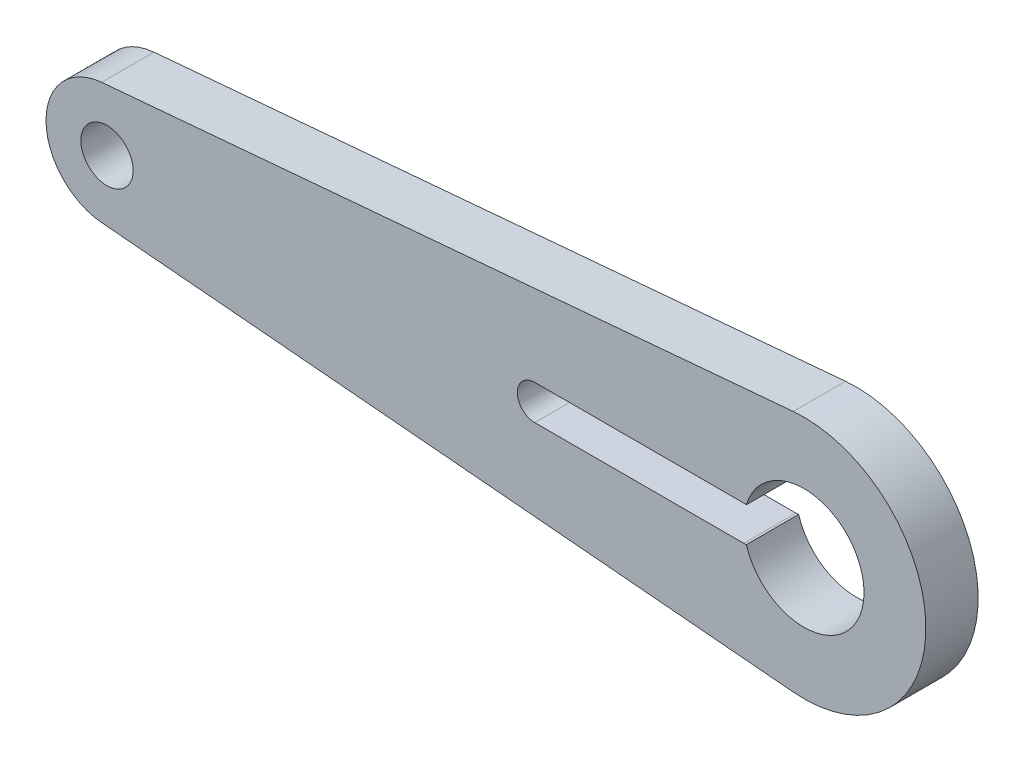
ISO-10303-21;
HEADER;
FILE_DESCRIPTION(('STEP AP214'),'2;1');
FILE_NAME('part.step','',(''),(''),'','','');
FILE_SCHEMA(('AUTOMOTIVE_DESIGN { 1 0 10303 214 1 1 1 1 }'));
ENDSEC;
DATA;
#1=APPLICATION_CONTEXT('core data for automotive mechanical design processes');
#2=APPLICATION_PROTOCOL_DEFINITION('international standard','automotive_design',2000,#1);
#3=PRODUCT_CONTEXT('',#1,'mechanical');
#4=PRODUCT('Part','Part','',(#3));
#5=PRODUCT_RELATED_PRODUCT_CATEGORY('part','',(#4));
#6=PRODUCT_DEFINITION_FORMATION('','',#4);
#7=PRODUCT_DEFINITION_CONTEXT('part definition',#1,'design');
#8=PRODUCT_DEFINITION('design','',#6,#7);
#9=PRODUCT_DEFINITION_SHAPE('','',#8);
#10=(LENGTH_UNIT() NAMED_UNIT(*) SI_UNIT(.MILLI.,.METRE.));
#11=(NAMED_UNIT(*) PLANE_ANGLE_UNIT() SI_UNIT($,.RADIAN.));
#12=(NAMED_UNIT(*) SI_UNIT($,.STERADIAN.) SOLID_ANGLE_UNIT());
#13=UNCERTAINTY_MEASURE_WITH_UNIT(LENGTH_MEASURE(1.E-05),#10,'distance_accuracy_value','');
#14=(GEOMETRIC_REPRESENTATION_CONTEXT(3) GLOBAL_UNCERTAINTY_ASSIGNED_CONTEXT((#13)) GLOBAL_UNIT_ASSIGNED_CONTEXT((#10,
#11,#12)) REPRESENTATION_CONTEXT('',''));
#15=CARTESIAN_POINT('',(0.,0.,0.));
#16=DIRECTION('',(0.,0.,1.));
#17=DIRECTION('',(1.,0.,0.));
#18=AXIS2_PLACEMENT_3D('',#15,#16,#17);
#19=CARTESIAN_POINT('',(-0.6125,6.97315163681387,3.));
#20=DIRECTION('',(-0.0875,0.996164519544839,0.));
#21=DIRECTION('',(-0.996164519544839,-0.0875,0.));
#22=AXIS2_PLACEMENT_3D('',#19,#20,#21);
#23=PLANE('',#22);
#24=DIRECTION('',(0.996164519544839,0.0875,0.));
#25=VECTOR('',#24,1.);
#26=CARTESIAN_POINT('',(-0.6125,6.97315163681387,0.));
#27=LINE('',#26,#25);
#28=CARTESIAN_POINT('',(-40.30625,3.48657581840694,0.));
#29=VERTEX_POINT('',#28);
#30=CARTESIAN_POINT('',(-0.6125,6.97315163681387,0.));
#31=VERTEX_POINT('',#30);
#32=EDGE_CURVE('E167',#29,#31,#27,.T.);
#33=ORIENTED_EDGE('',*,*,#32,.F.);
#34=DIRECTION('',(0.,0.,-1.));
#35=VECTOR('',#34,1.);
#36=CARTESIAN_POINT('',(-40.30625,3.48657581840694,3.));
#37=LINE('',#36,#35);
#38=CARTESIAN_POINT('',(-40.30625,3.48657581840694,3.));
#39=VERTEX_POINT('',#38);
#40=EDGE_CURVE('E11',#39,#29,#37,.T.);
#41=ORIENTED_EDGE('',*,*,#40,.F.);
#42=DIRECTION('',(0.996164519544839,0.0875,0.));
#43=VECTOR('',#42,1.);
#44=CARTESIAN_POINT('',(-0.6125,6.97315163681387,3.));
#45=LINE('',#44,#43);
#46=CARTESIAN_POINT('',(-0.6125,6.97315163681387,3.));
#47=VERTEX_POINT('',#46);
#48=EDGE_CURVE('E137',#39,#47,#45,.T.);
#49=ORIENTED_EDGE('',*,*,#48,.T.);
#50=DIRECTION('',(0.,0.,-1.));
#51=VECTOR('',#50,1.);
#52=CARTESIAN_POINT('',(-0.6125,6.97315163681387,3.));
#53=LINE('',#52,#51);
#54=EDGE_CURVE('E97',#47,#31,#53,.T.);
#55=ORIENTED_EDGE('',*,*,#54,.T.);
#56=EDGE_LOOP('',(#33,#41,#49,#55));
#57=FACE_BOUND('',#56,.T.);
#58=ADVANCED_FACE('F38',(#57),#23,.T.);
#59=CARTESIAN_POINT('',(-40.,0.,3.));
#60=DIRECTION('',(0.,0.,-1.));
#61=DIRECTION('',(-1.,0.,0.));
#62=AXIS2_PLACEMENT_3D('',#59,#60,#61);
#63=CYLINDRICAL_SURFACE('',#62,3.5);
#64=CARTESIAN_POINT('',(-40.,0.,0.));
#65=DIRECTION('',(0.,0.,1.));
#66=DIRECTION('',(1.,0.,0.));
#67=AXIS2_PLACEMENT_3D('',#64,#65,#66);
#68=CIRCLE('',#67,3.5);
#69=CARTESIAN_POINT('',(-40.30625,-3.48657581840694,0.));
#70=VERTEX_POINT('',#69);
#71=EDGE_CURVE('E142',#29,#70,#68,.T.);
#72=ORIENTED_EDGE('',*,*,#71,.T.);
#73=DIRECTION('',(0.,0.,-1.));
#74=VECTOR('',#73,1.);
#75=CARTESIAN_POINT('',(-40.30625,-3.48657581840694,3.));
#76=LINE('',#75,#74);
#77=CARTESIAN_POINT('',(-40.30625,-3.48657581840694,3.));
#78=VERTEX_POINT('',#77);
#79=EDGE_CURVE('E48',#78,#70,#76,.T.);
#80=ORIENTED_EDGE('',*,*,#79,.F.);
#81=CARTESIAN_POINT('',(-40.,0.,3.));
#82=DIRECTION('',(0.,0.,1.));
#83=DIRECTION('',(1.,0.,0.));
#84=AXIS2_PLACEMENT_3D('',#81,#82,#83);
#85=CIRCLE('',#84,3.5);
#86=EDGE_CURVE('E133',#39,#78,#85,.T.);
#87=ORIENTED_EDGE('',*,*,#86,.F.);
#88=ORIENTED_EDGE('',*,*,#40,.T.);
#89=EDGE_LOOP('',(#72,#80,#87,#88));
#90=FACE_BOUND('',#89,.T.);
#91=ADVANCED_FACE('F140',(#90),#63,.T.);
#92=CARTESIAN_POINT('',(-0.6125,-6.97315163681387,3.));
#93=DIRECTION('',(0.0875,0.996164519544839,0.));
#94=DIRECTION('',(-0.996164519544839,0.0875,0.));
#95=AXIS2_PLACEMENT_3D('',#92,#93,#94);
#96=PLANE('',#95);
#97=DIRECTION('',(0.996164519544839,-0.0875,0.));
#98=VECTOR('',#97,1.);
#99=CARTESIAN_POINT('',(-0.6125,-6.97315163681387,0.));
#100=LINE('',#99,#98);
#101=CARTESIAN_POINT('',(-0.6125,-6.97315163681387,0.));
#102=VERTEX_POINT('',#101);
#103=EDGE_CURVE('E164',#70,#102,#100,.T.);
#104=ORIENTED_EDGE('',*,*,#103,.T.);
#105=DIRECTION('',(0.,0.,-1.));
#106=VECTOR('',#105,1.);
#107=CARTESIAN_POINT('',(-0.6125,-6.97315163681387,3.));
#108=LINE('',#107,#106);
#109=CARTESIAN_POINT('',(-0.6125,-6.97315163681387,3.));
#110=VERTEX_POINT('',#109);
#111=EDGE_CURVE('E132',#110,#102,#108,.T.);
#112=ORIENTED_EDGE('',*,*,#111,.F.);
#113=DIRECTION('',(0.996164519544839,-0.0875,0.));
#114=VECTOR('',#113,1.);
#115=CARTESIAN_POINT('',(-0.6125,-6.97315163681387,3.));
#116=LINE('',#115,#114);
#117=EDGE_CURVE('E126',#78,#110,#116,.T.);
#118=ORIENTED_EDGE('',*,*,#117,.F.);
#119=ORIENTED_EDGE('',*,*,#79,.T.);
#120=EDGE_LOOP('',(#104,#112,#118,#119));
#121=FACE_BOUND('',#120,.T.);
#122=ADVANCED_FACE('F129',(#121),#96,.F.);
#123=CARTESIAN_POINT('',(-15.45,0.,3.));
#124=DIRECTION('',(0.,0.,-1.));
#125=DIRECTION('',(-1.,0.,0.));
#126=AXIS2_PLACEMENT_3D('',#123,#124,#125);
#127=CYLINDRICAL_SURFACE('',#126,0.999999999999999);
#128=CARTESIAN_POINT('',(-15.45,0.,0.));
#129=DIRECTION('',(0.,0.,1.));
#130=DIRECTION('',(1.,0.,0.));
#131=AXIS2_PLACEMENT_3D('',#128,#129,#130);
#132=CIRCLE('',#131,0.999999999999999);
#133=CARTESIAN_POINT('',(-15.45,0.999999999999997,0.));
#134=VERTEX_POINT('',#133);
#135=CARTESIAN_POINT('',(-15.45,-1.,0.));
#136=VERTEX_POINT('',#135);
#137=EDGE_CURVE('E185',#134,#136,#132,.T.);
#138=ORIENTED_EDGE('',*,*,#137,.F.);
#139=DIRECTION('',(0.,0.,-1.));
#140=VECTOR('',#139,1.);
#141=CARTESIAN_POINT('',(-15.45,0.999999999999997,3.));
#142=LINE('',#141,#140);
#143=CARTESIAN_POINT('',(-15.45,0.999999999999997,3.));
#144=VERTEX_POINT('',#143);
#145=EDGE_CURVE('E42',#144,#134,#142,.T.);
#146=ORIENTED_EDGE('',*,*,#145,.F.);
#147=CARTESIAN_POINT('',(-15.45,0.,3.));
#148=DIRECTION('',(0.,0.,1.));
#149=DIRECTION('',(1.,0.,0.));
#150=AXIS2_PLACEMENT_3D('',#147,#148,#149);
#151=CIRCLE('',#150,0.999999999999999);
#152=CARTESIAN_POINT('',(-15.45,-1.,3.));
#153=VERTEX_POINT('',#152);
#154=EDGE_CURVE('E163',#144,#153,#151,.T.);
#155=ORIENTED_EDGE('',*,*,#154,.T.);
#156=DIRECTION('',(0.,0.,-1.));
#157=VECTOR('',#156,1.);
#158=CARTESIAN_POINT('',(-15.45,-1.,3.));
#159=LINE('',#158,#157);
#160=EDGE_CURVE('E147',#153,#136,#159,.T.);
#161=ORIENTED_EDGE('',*,*,#160,.T.);
#162=EDGE_LOOP('',(#138,#146,#155,#161));
#163=FACE_BOUND('',#162,.T.);
#164=ADVANCED_FACE('F40',(#163),#127,.F.);
#165=CARTESIAN_POINT('',(0.,1.,3.));
#166=DIRECTION('',(0.,-1.,0.));
#167=DIRECTION('',(1.,0.,0.));
#168=AXIS2_PLACEMENT_3D('',#165,#166,#167);
#169=PLANE('',#168);
#170=DIRECTION('',(-1.,0.,0.));
#171=VECTOR('',#170,1.);
#172=CARTESIAN_POINT('',(0.,1.,0.));
#173=LINE('',#172,#171);
#174=CARTESIAN_POINT('',(-3.45,1.,0.));
#175=VERTEX_POINT('',#174);
#176=EDGE_CURVE('E182',#175,#134,#173,.T.);
#177=ORIENTED_EDGE('',*,*,#176,.F.);
#178=DIRECTION('',(0.,0.,-1.));
#179=VECTOR('',#178,1.);
#180=CARTESIAN_POINT('',(-3.45,1.,3.));
#181=LINE('',#180,#179);
#182=CARTESIAN_POINT('',(-3.45,1.,3.));
#183=VERTEX_POINT('',#182);
#184=EDGE_CURVE('E154',#183,#175,#181,.T.);
#185=ORIENTED_EDGE('',*,*,#184,.F.);
#186=DIRECTION('',(-1.,0.,0.));
#187=VECTOR('',#186,1.);
#188=CARTESIAN_POINT('',(0.,1.,3.));
#189=LINE('',#188,#187);
#190=EDGE_CURVE('E201',#183,#144,#189,.T.);
#191=ORIENTED_EDGE('',*,*,#190,.T.);
#192=ORIENTED_EDGE('',*,*,#145,.T.);
#193=EDGE_LOOP('',(#177,#185,#191,#192));
#194=FACE_BOUND('',#193,.T.);
#195=ADVANCED_FACE('F210',(#194),#169,.T.);
#196=CARTESIAN_POINT('',(-3.45,0.,3.));
#197=DIRECTION('',(0.,0.,-1.));
#198=DIRECTION('',(-1.,0.,0.));
#199=AXIS2_PLACEMENT_3D('',#196,#197,#198);
#200=CYLINDRICAL_SURFACE('',#199,1.);
#201=CARTESIAN_POINT('',(-3.45,0.,0.));
#202=DIRECTION('',(0.,0.,1.));
#203=DIRECTION('',(1.,0.,0.));
#204=AXIS2_PLACEMENT_3D('',#201,#202,#203);
#205=CIRCLE('',#204,1.);
#206=CARTESIAN_POINT('',(-3.30507246376812,0.989442271808596,0.));
#207=VERTEX_POINT('',#206);
#208=EDGE_CURVE('E179',#207,#175,#205,.T.);
#209=ORIENTED_EDGE('',*,*,#208,.F.);
#210=DIRECTION('',(0.,0.,-1.));
#211=VECTOR('',#210,1.);
#212=CARTESIAN_POINT('',(-3.30507246376812,0.989442271808596,3.));
#213=LINE('',#212,#211);
#214=CARTESIAN_POINT('',(-3.30507246376812,0.989442271808596,3.));
#215=VERTEX_POINT('',#214);
#216=EDGE_CURVE('E153',#215,#207,#213,.T.);
#217=ORIENTED_EDGE('',*,*,#216,.F.);
#218=CARTESIAN_POINT('',(-3.45,0.,3.));
#219=DIRECTION('',(0.,0.,1.));
#220=DIRECTION('',(1.,0.,0.));
#221=AXIS2_PLACEMENT_3D('',#218,#219,#220);
#222=CIRCLE('',#221,1.);
#223=EDGE_CURVE('E199',#215,#183,#222,.T.);
#224=ORIENTED_EDGE('',*,*,#223,.T.);
#225=ORIENTED_EDGE('',*,*,#184,.T.);
#226=EDGE_LOOP('',(#209,#217,#224,#225));
#227=FACE_BOUND('',#226,.T.);
#228=ADVANCED_FACE('F216',(#227),#200,.F.);
#229=CARTESIAN_POINT('',(0.,0.,3.));
#230=DIRECTION('',(0.,0.,-1.));
#231=DIRECTION('',(-1.,0.,0.));
#232=AXIS2_PLACEMENT_3D('',#229,#230,#231);
#233=CYLINDRICAL_SURFACE('',#232,3.45);
#234=CARTESIAN_POINT('',(0.,0.,0.));
#235=DIRECTION('',(0.,0.,1.));
#236=DIRECTION('',(1.,0.,0.));
#237=AXIS2_PLACEMENT_3D('',#234,#235,#236);
#238=CIRCLE('',#237,3.45);
#239=CARTESIAN_POINT('',(-3.30507246376812,-0.989442271808596,0.));
#240=VERTEX_POINT('',#239);
#241=EDGE_CURVE('E176',#240,#207,#238,.T.);
#242=ORIENTED_EDGE('',*,*,#241,.F.);
#243=DIRECTION('',(0.,0.,-1.));
#244=VECTOR('',#243,1.);
#245=CARTESIAN_POINT('',(-3.30507246376812,-0.989442271808596,3.));
#246=LINE('',#245,#244);
#247=CARTESIAN_POINT('',(-3.30507246376812,-0.989442271808596,3.));
#248=VERTEX_POINT('',#247);
#249=EDGE_CURVE('E151',#248,#240,#246,.T.);
#250=ORIENTED_EDGE('',*,*,#249,.F.);
#251=CARTESIAN_POINT('',(0.,0.,3.));
#252=DIRECTION('',(0.,0.,1.));
#253=DIRECTION('',(1.,0.,0.));
#254=AXIS2_PLACEMENT_3D('',#251,#252,#253);
#255=CIRCLE('',#254,3.45);
#256=EDGE_CURVE('E196',#248,#215,#255,.T.);
#257=ORIENTED_EDGE('',*,*,#256,.T.);
#258=ORIENTED_EDGE('',*,*,#216,.T.);
#259=EDGE_LOOP('',(#242,#250,#257,#258));
#260=FACE_BOUND('',#259,.T.);
#261=ADVANCED_FACE('F220',(#260),#233,.F.);
#262=CARTESIAN_POINT('',(-3.45,-1.,0.));
#263=VERTEX_POINT('',#262);
#264=EDGE_CURVE('E175',#263,#240,#205,.T.);
#265=ORIENTED_EDGE('',*,*,#264,.F.);
#266=DIRECTION('',(0.,0.,-1.));
#267=VECTOR('',#266,1.);
#268=CARTESIAN_POINT('',(-3.45,-1.,3.));
#269=LINE('',#268,#267);
#270=CARTESIAN_POINT('',(-3.45,-1.,3.));
#271=VERTEX_POINT('',#270);
#272=EDGE_CURVE('E149',#271,#263,#269,.T.);
#273=ORIENTED_EDGE('',*,*,#272,.F.);
#274=EDGE_CURVE('E195',#271,#248,#222,.T.);
#275=ORIENTED_EDGE('',*,*,#274,.T.);
#276=ORIENTED_EDGE('',*,*,#249,.T.);
#277=EDGE_LOOP('',(#265,#273,#275,#276));
#278=FACE_BOUND('',#277,.T.);
#279=ADVANCED_FACE('F223',(#278),#200,.F.);
#280=CARTESIAN_POINT('',(-40.,0.,3.));
#281=DIRECTION('',(0.,0.,-1.));
#282=DIRECTION('',(-1.,0.,0.));
#283=AXIS2_PLACEMENT_3D('',#280,#281,#282);
#284=CYLINDRICAL_SURFACE('',#283,1.5);
#285=CARTESIAN_POINT('',(-40.,0.,3.));
#286=DIRECTION('',(0.,0.,1.));
#287=DIRECTION('',(1.,0.,0.));
#288=AXIS2_PLACEMENT_3D('',#285,#286,#287);
#289=CIRCLE('',#288,1.5);
#290=CARTESIAN_POINT('',(-38.5,0.,3.));
#291=VERTEX_POINT('',#290);
#292=EDGE_CURVE('E190',#291,#291,#289,.T.);
#293=ORIENTED_EDGE('',*,*,#292,.T.);
#294=EDGE_LOOP('',(#293));
#295=FACE_BOUND('',#294,.T.);
#296=CARTESIAN_POINT('',(-40.,0.,0.));
#297=DIRECTION('',(0.,0.,1.));
#298=DIRECTION('',(1.,0.,0.));
#299=AXIS2_PLACEMENT_3D('',#296,#297,#298);
#300=CIRCLE('',#299,1.5);
#301=CARTESIAN_POINT('',(-38.5,0.,0.));
#302=VERTEX_POINT('',#301);
#303=EDGE_CURVE('E169',#302,#302,#300,.T.);
#304=ORIENTED_EDGE('',*,*,#303,.F.);
#305=EDGE_LOOP('',(#304));
#306=FACE_BOUND('',#305,.T.);
#307=ADVANCED_FACE('F229',(#295,#306),#284,.F.);
#308=CARTESIAN_POINT('',(0.,-1.,3.));
#309=DIRECTION('',(0.,-1.,0.));
#310=DIRECTION('',(0.,0.,-1.));
#311=AXIS2_PLACEMENT_3D('',#308,#309,#310);
#312=PLANE('',#311);
#313=DIRECTION('',(-1.,0.,0.));
#314=VECTOR('',#313,1.);
#315=CARTESIAN_POINT('',(0.,-1.,0.));
#316=LINE('',#315,#314);
#317=EDGE_CURVE('E172',#263,#136,#316,.T.);
#318=ORIENTED_EDGE('',*,*,#317,.T.);
#319=ORIENTED_EDGE('',*,*,#160,.F.);
#320=DIRECTION('',(-1.,0.,0.));
#321=VECTOR('',#320,1.);
#322=CARTESIAN_POINT('',(0.,-1.,3.));
#323=LINE('',#322,#321);
#324=EDGE_CURVE('E193',#271,#153,#323,.T.);
#325=ORIENTED_EDGE('',*,*,#324,.F.);
#326=ORIENTED_EDGE('',*,*,#272,.T.);
#327=EDGE_LOOP('',(#318,#319,#325,#326));
#328=FACE_BOUND('',#327,.T.);
#329=ADVANCED_FACE('F226',(#328),#312,.F.);
#330=CARTESIAN_POINT('',(0.,0.,3.));
#331=DIRECTION('',(0.,0.,-1.));
#332=DIRECTION('',(-1.,0.,0.));
#333=AXIS2_PLACEMENT_3D('',#330,#331,#332);
#334=CYLINDRICAL_SURFACE('',#333,7.);
#335=CARTESIAN_POINT('',(0.,0.,0.));
#336=DIRECTION('',(0.,0.,1.));
#337=DIRECTION('',(1.,0.,0.));
#338=AXIS2_PLACEMENT_3D('',#335,#336,#337);
#339=CIRCLE('',#338,7.);
#340=EDGE_CURVE('E90',#102,#31,#339,.T.);
#341=ORIENTED_EDGE('',*,*,#340,.T.);
#342=ORIENTED_EDGE('',*,*,#54,.F.);
#343=CARTESIAN_POINT('',(0.,0.,3.));
#344=DIRECTION('',(0.,0.,1.));
#345=DIRECTION('',(1.,0.,0.));
#346=AXIS2_PLACEMENT_3D('',#343,#344,#345);
#347=CIRCLE('',#346,7.);
#348=EDGE_CURVE('E57',#110,#47,#347,.T.);
#349=ORIENTED_EDGE('',*,*,#348,.F.);
#350=ORIENTED_EDGE('',*,*,#111,.T.);
#351=EDGE_LOOP('',(#341,#342,#349,#350));
#352=FACE_BOUND('',#351,.T.);
#353=ADVANCED_FACE('F228',(#352),#334,.T.);
#354=CARTESIAN_POINT('',(0.,0.,3.));
#355=DIRECTION('',(0.,0.,1.));
#356=DIRECTION('',(1.,0.,0.));
#357=AXIS2_PLACEMENT_3D('',#354,#355,#356);
#358=PLANE('',#357);
#359=ORIENTED_EDGE('',*,*,#154,.F.);
#360=ORIENTED_EDGE('',*,*,#190,.F.);
#361=ORIENTED_EDGE('',*,*,#223,.F.);
#362=ORIENTED_EDGE('',*,*,#256,.F.);
#363=ORIENTED_EDGE('',*,*,#274,.F.);
#364=ORIENTED_EDGE('',*,*,#324,.T.);
#365=EDGE_LOOP('',(#359,#360,#361,#362,#363,#364));
#366=FACE_BOUND('',#365,.T.);
#367=ORIENTED_EDGE('',*,*,#292,.F.);
#368=EDGE_LOOP('',(#367));
#369=FACE_BOUND('',#368,.T.);
#370=ORIENTED_EDGE('',*,*,#48,.F.);
#371=ORIENTED_EDGE('',*,*,#86,.T.);
#372=ORIENTED_EDGE('',*,*,#117,.T.);
#373=ORIENTED_EDGE('',*,*,#348,.T.);
#374=EDGE_LOOP('',(#370,#371,#372,#373));
#375=FACE_BOUND('',#374,.T.);
#376=ADVANCED_FACE('F136',(#366,#369,#375),#358,.T.);
#377=CARTESIAN_POINT('',(0.,0.,0.));
#378=DIRECTION('',(0.,0.,1.));
#379=DIRECTION('',(1.,0.,0.));
#380=AXIS2_PLACEMENT_3D('',#377,#378,#379);
#381=PLANE('',#380);
#382=ORIENTED_EDGE('',*,*,#137,.T.);
#383=ORIENTED_EDGE('',*,*,#317,.F.);
#384=ORIENTED_EDGE('',*,*,#264,.T.);
#385=ORIENTED_EDGE('',*,*,#241,.T.);
#386=ORIENTED_EDGE('',*,*,#208,.T.);
#387=ORIENTED_EDGE('',*,*,#176,.T.);
#388=EDGE_LOOP('',(#382,#383,#384,#385,#386,#387));
#389=FACE_BOUND('',#388,.T.);
#390=ORIENTED_EDGE('',*,*,#303,.T.);
#391=EDGE_LOOP('',(#390));
#392=FACE_BOUND('',#391,.T.);
#393=ORIENTED_EDGE('',*,*,#32,.T.);
#394=ORIENTED_EDGE('',*,*,#340,.F.);
#395=ORIENTED_EDGE('',*,*,#103,.F.);
#396=ORIENTED_EDGE('',*,*,#71,.F.);
#397=EDGE_LOOP('',(#393,#394,#395,#396));
#398=FACE_BOUND('',#397,.T.);
#399=ADVANCED_FACE('F212',(#389,#392,#398),#381,.F.);
#400=CLOSED_SHELL('',(#58,#91,#122,#164,#195,#228,#261,#279,#307,#329,#353,#376,#399));
#401=MANIFOLD_SOLID_BREP('B2',#400);
#402=ADVANCED_BREP_SHAPE_REPRESENTATION('',(#18,#401),#14);
#403=SHAPE_DEFINITION_REPRESENTATION(#9,#402);
ENDSEC;
END-ISO-10303-21;
